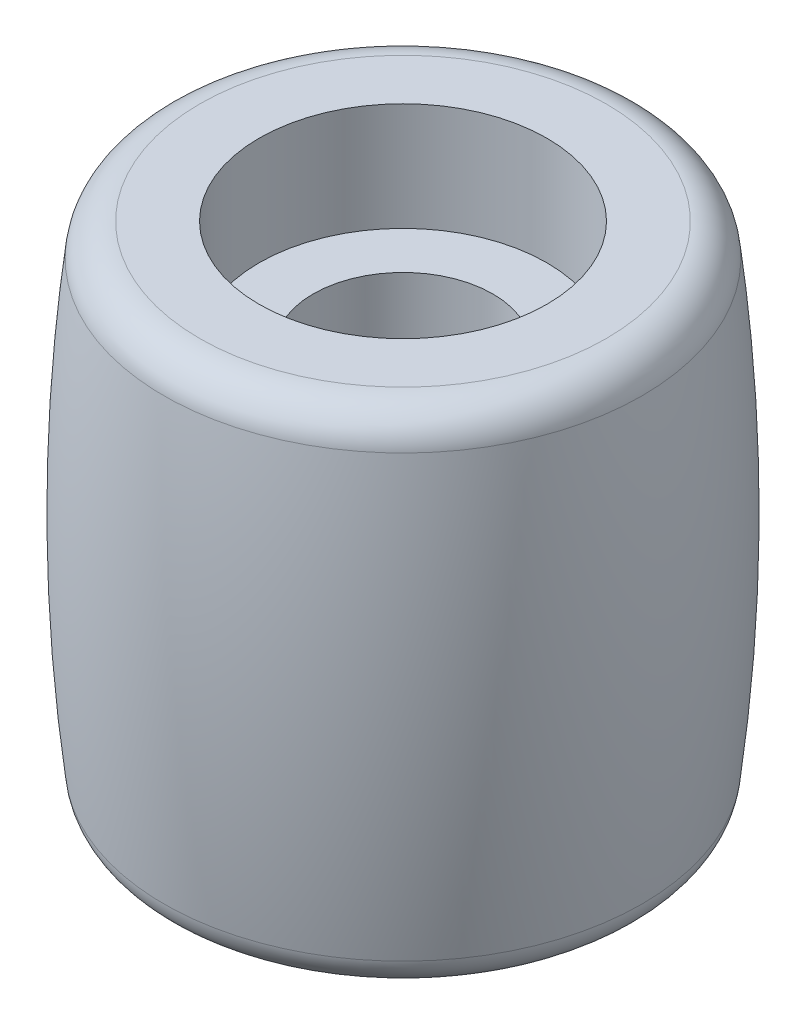
ISO-10303-21;
HEADER;
FILE_DESCRIPTION(('STEP AP214'),'2;1');
FILE_NAME('part.step','',(''),(''),'','','');
FILE_SCHEMA(('AUTOMOTIVE_DESIGN { 1 0 10303 214 1 1 1 1 }'));
ENDSEC;
DATA;
#1=APPLICATION_CONTEXT('core data for automotive mechanical design processes');
#2=APPLICATION_PROTOCOL_DEFINITION('international standard','automotive_design',2000,#1);
#3=PRODUCT_CONTEXT('',#1,'mechanical');
#4=PRODUCT('Part','Part','',(#3));
#5=PRODUCT_RELATED_PRODUCT_CATEGORY('part','',(#4));
#6=PRODUCT_DEFINITION_FORMATION('','',#4);
#7=PRODUCT_DEFINITION_CONTEXT('part definition',#1,'design');
#8=PRODUCT_DEFINITION('design','',#6,#7);
#9=PRODUCT_DEFINITION_SHAPE('','',#8);
#10=(LENGTH_UNIT() NAMED_UNIT(*) SI_UNIT(.MILLI.,.METRE.));
#11=(NAMED_UNIT(*) PLANE_ANGLE_UNIT() SI_UNIT($,.RADIAN.));
#12=(NAMED_UNIT(*) SI_UNIT($,.STERADIAN.) SOLID_ANGLE_UNIT());
#13=UNCERTAINTY_MEASURE_WITH_UNIT(LENGTH_MEASURE(1.E-05),#10,'distance_accuracy_value','');
#14=(GEOMETRIC_REPRESENTATION_CONTEXT(3) GLOBAL_UNCERTAINTY_ASSIGNED_CONTEXT((#13)) GLOBAL_UNIT_ASSIGNED_CONTEXT((#10,
#11,#12)) REPRESENTATION_CONTEXT('',''));
#15=CARTESIAN_POINT('',(0.,0.,0.));
#16=DIRECTION('',(0.,0.,1.));
#17=DIRECTION('',(1.,0.,0.));
#18=AXIS2_PLACEMENT_3D('',#15,#16,#17);
#19=CARTESIAN_POINT('',(45.5,7.,0.));
#20=DIRECTION('',(0.,-1.,0.));
#21=DIRECTION('',(1.,0.,0.));
#22=AXIS2_PLACEMENT_3D('',#19,#20,#21);
#23=CYLINDRICAL_SURFACE('',#22,2.5);
#24=CARTESIAN_POINT('',(45.5,4.,0.));
#25=DIRECTION('',(0.,1.,0.));
#26=DIRECTION('',(-1.,0.,0.));
#27=AXIS2_PLACEMENT_3D('',#24,#25,#26);
#28=CIRCLE('',#27,2.5);
#29=CARTESIAN_POINT('',(43.,4.,0.));
#30=VERTEX_POINT('',#29);
#31=EDGE_CURVE('E51',#30,#30,#28,.F.);
#32=ORIENTED_EDGE('',*,*,#31,.F.);
#33=EDGE_LOOP('',(#32));
#34=FACE_BOUND('',#33,.T.);
#35=CARTESIAN_POINT('',(45.5,-4.,0.));
#36=DIRECTION('',(0.,-1.,0.));
#37=DIRECTION('',(1.,0.,0.));
#38=AXIS2_PLACEMENT_3D('',#35,#36,#37);
#39=CIRCLE('',#38,2.5);
#40=CARTESIAN_POINT('',(48.,-4.,0.));
#41=VERTEX_POINT('',#40);
#42=EDGE_CURVE('E39',#41,#41,#39,.F.);
#43=ORIENTED_EDGE('',*,*,#42,.F.);
#44=EDGE_LOOP('',(#43));
#45=FACE_BOUND('',#44,.T.);
#46=ADVANCED_FACE('F35',(#34,#45),#23,.F.);
#47=CARTESIAN_POINT('',(0.,-7.00000000000001,0.));
#48=DIRECTION('',(0.,-1.,0.));
#49=DIRECTION('',(1.,0.,0.));
#50=AXIS2_PLACEMENT_3D('',#47,#48,#49);
#51=PLANE('',#50);
#52=CARTESIAN_POINT('',(45.5,-7.,0.));
#53=DIRECTION('',(0.,-1.,0.));
#54=DIRECTION('',(1.,0.,0.));
#55=AXIS2_PLACEMENT_3D('',#52,#53,#54);
#56=CIRCLE('',#55,4.00000000000001);
#57=CARTESIAN_POINT('',(49.5,-7.,0.));
#58=VERTEX_POINT('',#57);
#59=EDGE_CURVE('E67',#58,#58,#56,.T.);
#60=ORIENTED_EDGE('',*,*,#59,.F.);
#61=EDGE_LOOP('',(#60));
#62=FACE_BOUND('',#61,.T.);
#63=CARTESIAN_POINT('',(45.5,-7.,0.));
#64=DIRECTION('',(0.,-1.,0.));
#65=DIRECTION('',(1.,0.,0.));
#66=AXIS2_PLACEMENT_3D('',#63,#64,#65);
#67=CIRCLE('',#66,5.64929129518804);
#68=CARTESIAN_POINT('',(51.149291295188,-7.,0.));
#69=VERTEX_POINT('',#68);
#70=EDGE_CURVE('E53',#69,#69,#67,.T.);
#71=ORIENTED_EDGE('',*,*,#70,.T.);
#72=EDGE_LOOP('',(#71));
#73=FACE_BOUND('',#72,.T.);
#74=ADVANCED_FACE('F87',(#62,#73),#51,.T.);
#75=CARTESIAN_POINT('',(45.5,0.,0.));
#76=DIRECTION('',(0.,-1.,0.));
#77=DIRECTION('',(1.,0.,0.));
#78=AXIS2_PLACEMENT_3D('',#75,#76,#77);
#79=DEGENERATE_TOROIDAL_SURFACE('',#78,45.5,52.5,.F.);
#80=CARTESIAN_POINT('',(45.5,-6.11650485436893,0.));
#81=DIRECTION('',(0.,1.,0.));
#82=DIRECTION('',(-1.,0.,0.));
#83=AXIS2_PLACEMENT_3D('',#80,#81,#82);
#84=CIRCLE('',#83,6.6424814174247);
#85=CARTESIAN_POINT('',(38.8575185825753,-6.11650485436893,0.));
#86=VERTEX_POINT('',#85);
#87=EDGE_CURVE('E43',#86,#86,#84,.T.);
#88=ORIENTED_EDGE('',*,*,#87,.T.);
#89=EDGE_LOOP('',(#88));
#90=FACE_BOUND('',#89,.T.);
#91=CARTESIAN_POINT('',(45.5,6.11650485436893,0.));
#92=DIRECTION('',(0.,-1.,0.));
#93=DIRECTION('',(1.,0.,0.));
#94=AXIS2_PLACEMENT_3D('',#91,#92,#93);
#95=CIRCLE('',#94,6.64248141742471);
#96=CARTESIAN_POINT('',(52.1424814174247,6.11650485436893,0.));
#97=VERTEX_POINT('',#96);
#98=EDGE_CURVE('E48',#97,#97,#95,.T.);
#99=ORIENTED_EDGE('',*,*,#98,.T.);
#100=EDGE_LOOP('',(#99));
#101=FACE_BOUND('',#100,.T.);
#102=ADVANCED_FACE('F72',(#90,#101),#79,.F.);
#103=CARTESIAN_POINT('',(0.,6.99999999999999,0.));
#104=DIRECTION('',(0.,-1.,0.));
#105=DIRECTION('',(1.,0.,0.));
#106=AXIS2_PLACEMENT_3D('',#103,#104,#105);
#107=PLANE('',#106);
#108=CARTESIAN_POINT('',(45.5,7.,0.));
#109=DIRECTION('',(0.,1.,0.));
#110=DIRECTION('',(-1.,0.,0.));
#111=AXIS2_PLACEMENT_3D('',#108,#109,#110);
#112=CIRCLE('',#111,4.00000000000001);
#113=CARTESIAN_POINT('',(41.5,7.,0.));
#114=VERTEX_POINT('',#113);
#115=EDGE_CURVE('E60',#114,#114,#112,.T.);
#116=ORIENTED_EDGE('',*,*,#115,.F.);
#117=EDGE_LOOP('',(#116));
#118=FACE_BOUND('',#117,.T.);
#119=CARTESIAN_POINT('',(45.5,7.,0.));
#120=DIRECTION('',(0.,-1.,0.));
#121=DIRECTION('',(1.,0.,0.));
#122=AXIS2_PLACEMENT_3D('',#119,#120,#121);
#123=CIRCLE('',#122,5.64929129518804);
#124=CARTESIAN_POINT('',(51.149291295188,7.,0.));
#125=VERTEX_POINT('',#124);
#126=EDGE_CURVE('E10',#125,#125,#123,.F.);
#127=ORIENTED_EDGE('',*,*,#126,.T.);
#128=EDGE_LOOP('',(#127));
#129=FACE_BOUND('',#128,.T.);
#130=ADVANCED_FACE('F84',(#118,#129),#107,.F.);
#131=CARTESIAN_POINT('',(45.5,-6.,0.));
#132=DIRECTION('',(0.,-1.,0.));
#133=DIRECTION('',(1.,0.,0.));
#134=AXIS2_PLACEMENT_3D('',#131,#132,#133);
#135=TOROIDAL_SURFACE('',#134,5.64929129518804,1.);
#136=ORIENTED_EDGE('',*,*,#87,.F.);
#137=EDGE_LOOP('',(#136));
#138=FACE_BOUND('',#137,.T.);
#139=ORIENTED_EDGE('',*,*,#70,.F.);
#140=EDGE_LOOP('',(#139));
#141=FACE_BOUND('',#140,.T.);
#142=ADVANCED_FACE('F76',(#138,#141),#135,.T.);
#143=CARTESIAN_POINT('',(45.5,6.,0.));
#144=DIRECTION('',(0.,-1.,0.));
#145=DIRECTION('',(1.,0.,0.));
#146=AXIS2_PLACEMENT_3D('',#143,#144,#145);
#147=TOROIDAL_SURFACE('',#146,5.64929129518804,1.);
#148=ORIENTED_EDGE('',*,*,#126,.F.);
#149=EDGE_LOOP('',(#148));
#150=FACE_BOUND('',#149,.T.);
#151=ORIENTED_EDGE('',*,*,#98,.F.);
#152=EDGE_LOOP('',(#151));
#153=FACE_BOUND('',#152,.T.);
#154=ADVANCED_FACE('F37',(#150,#153),#147,.T.);
#155=CARTESIAN_POINT('',(45.5,4.,0.));
#156=DIRECTION('',(0.,1.,0.));
#157=DIRECTION('',(-1.,0.,0.));
#158=AXIS2_PLACEMENT_3D('',#155,#156,#157);
#159=PLANE('',#158);
#160=CARTESIAN_POINT('',(45.5,4.,0.));
#161=DIRECTION('',(0.,1.,0.));
#162=DIRECTION('',(-1.,0.,0.));
#163=AXIS2_PLACEMENT_3D('',#160,#161,#162);
#164=CIRCLE('',#163,4.00000000000001);
#165=CARTESIAN_POINT('',(41.5,4.,0.));
#166=VERTEX_POINT('',#165);
#167=EDGE_CURVE('E54',#166,#166,#164,.T.);
#168=ORIENTED_EDGE('',*,*,#167,.T.);
#169=EDGE_LOOP('',(#168));
#170=FACE_BOUND('',#169,.T.);
#171=ORIENTED_EDGE('',*,*,#31,.T.);
#172=EDGE_LOOP('',(#171));
#173=FACE_BOUND('',#172,.T.);
#174=ADVANCED_FACE('F75',(#170,#173),#159,.T.);
#175=CARTESIAN_POINT('',(45.5,4.,0.));
#176=DIRECTION('',(0.,1.,0.));
#177=DIRECTION('',(-1.,0.,0.));
#178=AXIS2_PLACEMENT_3D('',#175,#176,#177);
#179=CYLINDRICAL_SURFACE('',#178,4.00000000000001);
#180=ORIENTED_EDGE('',*,*,#167,.F.);
#181=EDGE_LOOP('',(#180));
#182=FACE_BOUND('',#181,.T.);
#183=ORIENTED_EDGE('',*,*,#115,.T.);
#184=EDGE_LOOP('',(#183));
#185=FACE_BOUND('',#184,.T.);
#186=ADVANCED_FACE('F82',(#182,#185),#179,.F.);
#187=CARTESIAN_POINT('',(45.5,-4.,0.));
#188=DIRECTION('',(0.,-1.,0.));
#189=DIRECTION('',(1.,0.,0.));
#190=AXIS2_PLACEMENT_3D('',#187,#188,#189);
#191=PLANE('',#190);
#192=CARTESIAN_POINT('',(45.5,-4.,0.));
#193=DIRECTION('',(0.,-1.,0.));
#194=DIRECTION('',(1.,0.,0.));
#195=AXIS2_PLACEMENT_3D('',#192,#193,#194);
#196=CIRCLE('',#195,4.00000000000001);
#197=CARTESIAN_POINT('',(49.5,-4.,0.));
#198=VERTEX_POINT('',#197);
#199=EDGE_CURVE('E168',#198,#198,#196,.T.);
#200=ORIENTED_EDGE('',*,*,#199,.T.);
#201=EDGE_LOOP('',(#200));
#202=FACE_BOUND('',#201,.T.);
#203=ORIENTED_EDGE('',*,*,#42,.T.);
#204=EDGE_LOOP('',(#203));
#205=FACE_BOUND('',#204,.T.);
#206=ADVANCED_FACE('F138',(#202,#205),#191,.T.);
#207=CARTESIAN_POINT('',(45.5,-4.,0.));
#208=DIRECTION('',(0.,-1.,0.));
#209=DIRECTION('',(1.,0.,0.));
#210=AXIS2_PLACEMENT_3D('',#207,#208,#209);
#211=CYLINDRICAL_SURFACE('',#210,4.00000000000001);
#212=ORIENTED_EDGE('',*,*,#199,.F.);
#213=EDGE_LOOP('',(#212));
#214=FACE_BOUND('',#213,.T.);
#215=ORIENTED_EDGE('',*,*,#59,.T.);
#216=EDGE_LOOP('',(#215));
#217=FACE_BOUND('',#216,.T.);
#218=ADVANCED_FACE('F150',(#214,#217),#211,.F.);
#219=CLOSED_SHELL('',(#46,#74,#102,#130,#142,#154,#174,#186,#206,#218));
#220=MANIFOLD_SOLID_BREP('B2',#219);
#221=ADVANCED_BREP_SHAPE_REPRESENTATION('',(#18,#220),#14);
#222=SHAPE_DEFINITION_REPRESENTATION(#9,#221);
ENDSEC;
END-ISO-10303-21;
